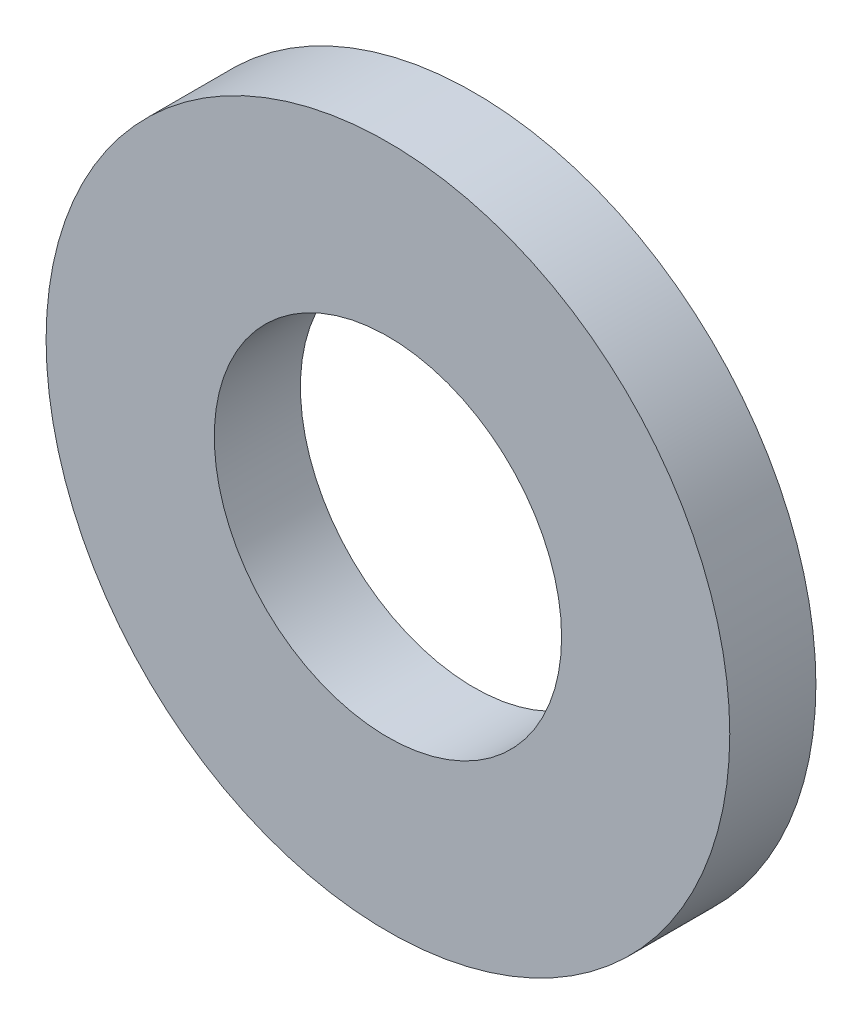
ISO-10303-21;
HEADER;
FILE_DESCRIPTION(('STEP AP214'),'2;1');
FILE_NAME('part.step','',(''),(''),'','','');
FILE_SCHEMA(('AUTOMOTIVE_DESIGN { 1 0 10303 214 1 1 1 1 }'));
ENDSEC;
DATA;
#1=APPLICATION_CONTEXT('core data for automotive mechanical design processes');
#2=APPLICATION_PROTOCOL_DEFINITION('international standard','automotive_design',2000,#1);
#3=PRODUCT_CONTEXT('',#1,'mechanical');
#4=PRODUCT('Part','Part','',(#3));
#5=PRODUCT_RELATED_PRODUCT_CATEGORY('part','',(#4));
#6=PRODUCT_DEFINITION_FORMATION('','',#4);
#7=PRODUCT_DEFINITION_CONTEXT('part definition',#1,'design');
#8=PRODUCT_DEFINITION('design','',#6,#7);
#9=PRODUCT_DEFINITION_SHAPE('','',#8);
#10=(LENGTH_UNIT() NAMED_UNIT(*) SI_UNIT(.MILLI.,.METRE.));
#11=(NAMED_UNIT(*) PLANE_ANGLE_UNIT() SI_UNIT($,.RADIAN.));
#12=(NAMED_UNIT(*) SI_UNIT($,.STERADIAN.) SOLID_ANGLE_UNIT());
#13=UNCERTAINTY_MEASURE_WITH_UNIT(LENGTH_MEASURE(1.E-05),#10,'distance_accuracy_value','');
#14=(GEOMETRIC_REPRESENTATION_CONTEXT(3) GLOBAL_UNCERTAINTY_ASSIGNED_CONTEXT((#13)) GLOBAL_UNIT_ASSIGNED_CONTEXT((#10,
#11,#12)) REPRESENTATION_CONTEXT('',''));
#15=CARTESIAN_POINT('',(0.,0.,0.));
#16=DIRECTION('',(0.,0.,1.));
#17=DIRECTION('',(1.,0.,0.));
#18=AXIS2_PLACEMENT_3D('',#15,#16,#17);
#19=CARTESIAN_POINT('',(0.,0.,1.6));
#20=DIRECTION('',(0.,0.,1.));
#21=DIRECTION('',(1.,0.,0.));
#22=AXIS2_PLACEMENT_3D('',#19,#20,#21);
#23=PLANE('',#22);
#24=CARTESIAN_POINT('',(0.,0.,1.6));
#25=DIRECTION('',(0.,0.,1.));
#26=DIRECTION('',(1.,0.,0.));
#27=AXIS2_PLACEMENT_3D('',#24,#25,#26);
#28=CIRCLE('',#27,6.35);
#29=CARTESIAN_POINT('',(6.35,0.,1.6));
#30=VERTEX_POINT('',#29);
#31=EDGE_CURVE('E10',#30,#30,#28,.T.);
#32=ORIENTED_EDGE('',*,*,#31,.T.);
#33=EDGE_LOOP('',(#32));
#34=FACE_BOUND('',#33,.T.);
#35=CARTESIAN_POINT('',(0.,0.,1.6));
#36=DIRECTION('',(0.,0.,1.));
#37=DIRECTION('',(1.,0.,0.));
#38=AXIS2_PLACEMENT_3D('',#35,#36,#37);
#39=CIRCLE('',#38,3.2258);
#40=CARTESIAN_POINT('',(3.2258,0.,1.6));
#41=VERTEX_POINT('',#40);
#42=EDGE_CURVE('E43',#41,#41,#39,.T.);
#43=ORIENTED_EDGE('',*,*,#42,.F.);
#44=EDGE_LOOP('',(#43));
#45=FACE_BOUND('',#44,.T.);
#46=ADVANCED_FACE('F32',(#34,#45),#23,.T.);
#47=CARTESIAN_POINT('',(0.,0.,0.));
#48=DIRECTION('',(0.,0.,1.));
#49=DIRECTION('',(1.,0.,0.));
#50=AXIS2_PLACEMENT_3D('',#47,#48,#49);
#51=PLANE('',#50);
#52=CARTESIAN_POINT('',(0.,0.,0.));
#53=DIRECTION('',(0.,0.,1.));
#54=DIRECTION('',(1.,0.,0.));
#55=AXIS2_PLACEMENT_3D('',#52,#53,#54);
#56=CIRCLE('',#55,6.35);
#57=CARTESIAN_POINT('',(6.35,0.,0.));
#58=VERTEX_POINT('',#57);
#59=EDGE_CURVE('E36',#58,#58,#56,.T.);
#60=ORIENTED_EDGE('',*,*,#59,.F.);
#61=EDGE_LOOP('',(#60));
#62=FACE_BOUND('',#61,.T.);
#63=CARTESIAN_POINT('',(0.,0.,0.));
#64=DIRECTION('',(0.,0.,1.));
#65=DIRECTION('',(1.,0.,0.));
#66=AXIS2_PLACEMENT_3D('',#63,#64,#65);
#67=CIRCLE('',#66,3.2258);
#68=CARTESIAN_POINT('',(3.2258,0.,0.));
#69=VERTEX_POINT('',#68);
#70=EDGE_CURVE('E45',#69,#69,#67,.T.);
#71=ORIENTED_EDGE('',*,*,#70,.T.);
#72=EDGE_LOOP('',(#71));
#73=FACE_BOUND('',#72,.T.);
#74=ADVANCED_FACE('F55',(#62,#73),#51,.F.);
#75=CARTESIAN_POINT('',(0.,0.,1.6));
#76=DIRECTION('',(0.,0.,-1.));
#77=DIRECTION('',(-1.,0.,0.));
#78=AXIS2_PLACEMENT_3D('',#75,#76,#77);
#79=CYLINDRICAL_SURFACE('',#78,6.35);
#80=ORIENTED_EDGE('',*,*,#31,.F.);
#81=EDGE_LOOP('',(#80));
#82=FACE_BOUND('',#81,.T.);
#83=ORIENTED_EDGE('',*,*,#59,.T.);
#84=EDGE_LOOP('',(#83));
#85=FACE_BOUND('',#84,.T.);
#86=ADVANCED_FACE('F34',(#82,#85),#79,.T.);
#87=CARTESIAN_POINT('',(0.,0.,1.6));
#88=DIRECTION('',(0.,0.,-1.));
#89=DIRECTION('',(-1.,0.,0.));
#90=AXIS2_PLACEMENT_3D('',#87,#88,#89);
#91=CYLINDRICAL_SURFACE('',#90,3.2258);
#92=ORIENTED_EDGE('',*,*,#42,.T.);
#93=EDGE_LOOP('',(#92));
#94=FACE_BOUND('',#93,.T.);
#95=ORIENTED_EDGE('',*,*,#70,.F.);
#96=EDGE_LOOP('',(#95));
#97=FACE_BOUND('',#96,.T.);
#98=ADVANCED_FACE('F51',(#94,#97),#91,.F.);
#99=CLOSED_SHELL('',(#46,#74,#86,#98));
#100=MANIFOLD_SOLID_BREP('B2',#99);
#101=ADVANCED_BREP_SHAPE_REPRESENTATION('',(#18,#100),#14);
#102=SHAPE_DEFINITION_REPRESENTATION(#9,#101);
ENDSEC;
END-ISO-10303-21;
